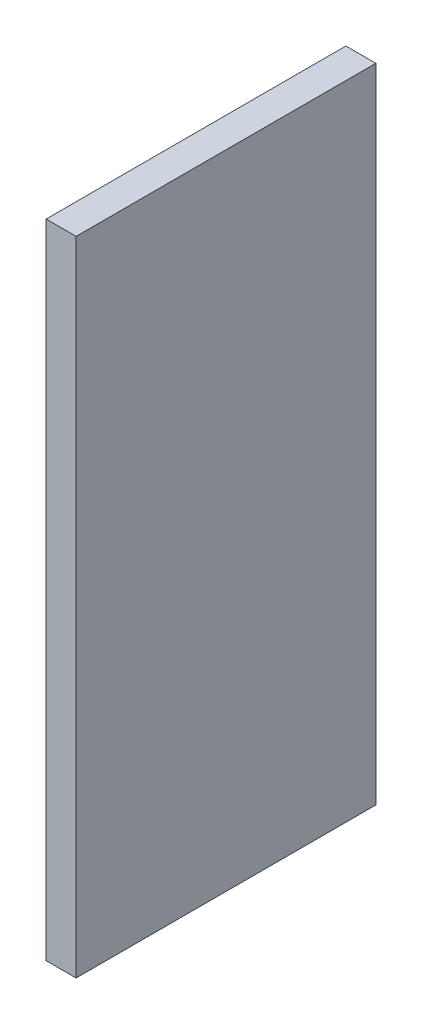
ISO-10303-21;
HEADER;
FILE_DESCRIPTION(('STEP AP214'),'2;1');
FILE_NAME('part.step','',(''),(''),'','','');
FILE_SCHEMA(('AUTOMOTIVE_DESIGN { 1 0 10303 214 1 1 1 1 }'));
ENDSEC;
DATA;
#1=APPLICATION_CONTEXT('core data for automotive mechanical design processes');
#2=APPLICATION_PROTOCOL_DEFINITION('international standard','automotive_design',2000,#1);
#3=PRODUCT_CONTEXT('',#1,'mechanical');
#4=PRODUCT('Part','Part','',(#3));
#5=PRODUCT_RELATED_PRODUCT_CATEGORY('part','',(#4));
#6=PRODUCT_DEFINITION_FORMATION('','',#4);
#7=PRODUCT_DEFINITION_CONTEXT('part definition',#1,'design');
#8=PRODUCT_DEFINITION('design','',#6,#7);
#9=PRODUCT_DEFINITION_SHAPE('','',#8);
#10=(LENGTH_UNIT() NAMED_UNIT(*) SI_UNIT(.MILLI.,.METRE.));
#11=(NAMED_UNIT(*) PLANE_ANGLE_UNIT() SI_UNIT($,.RADIAN.));
#12=(NAMED_UNIT(*) SI_UNIT($,.STERADIAN.) SOLID_ANGLE_UNIT());
#13=UNCERTAINTY_MEASURE_WITH_UNIT(LENGTH_MEASURE(1.E-05),#10,'distance_accuracy_value','');
#14=(GEOMETRIC_REPRESENTATION_CONTEXT(3) GLOBAL_UNCERTAINTY_ASSIGNED_CONTEXT((#13)) GLOBAL_UNIT_ASSIGNED_CONTEXT((#10,
#11,#12)) REPRESENTATION_CONTEXT('',''));
#15=CARTESIAN_POINT('',(0.,0.,0.));
#16=DIRECTION('',(0.,0.,1.));
#17=DIRECTION('',(1.,0.,0.));
#18=AXIS2_PLACEMENT_3D('',#15,#16,#17);
#19=CARTESIAN_POINT('',(0.,150.,70.));
#20=DIRECTION('',(1.,0.,0.));
#21=DIRECTION('',(0.,0.,-1.));
#22=AXIS2_PLACEMENT_3D('',#19,#20,#21);
#23=PLANE('',#22);
#24=DIRECTION('',(0.,-1.,0.));
#25=VECTOR('',#24,1.);
#26=CARTESIAN_POINT('',(0.,150.,0.));
#27=LINE('',#26,#25);
#28=CARTESIAN_POINT('',(0.,150.,0.));
#29=VERTEX_POINT('',#28);
#30=CARTESIAN_POINT('',(0.,0.,0.));
#31=VERTEX_POINT('',#30);
#32=EDGE_CURVE('E95',#29,#31,#27,.T.);
#33=ORIENTED_EDGE('',*,*,#32,.T.);
#34=DIRECTION('',(0.,0.,-1.));
#35=VECTOR('',#34,1.);
#36=CARTESIAN_POINT('',(0.,0.,70.));
#37=LINE('',#36,#35);
#38=CARTESIAN_POINT('',(0.,0.,70.));
#39=VERTEX_POINT('',#38);
#40=EDGE_CURVE('E11',#39,#31,#37,.T.);
#41=ORIENTED_EDGE('',*,*,#40,.F.);
#42=DIRECTION('',(0.,-1.,0.));
#43=VECTOR('',#42,1.);
#44=CARTESIAN_POINT('',(0.,150.,70.));
#45=LINE('',#44,#43);
#46=CARTESIAN_POINT('',(0.,150.,70.));
#47=VERTEX_POINT('',#46);
#48=EDGE_CURVE('E83',#47,#39,#45,.T.);
#49=ORIENTED_EDGE('',*,*,#48,.F.);
#50=DIRECTION('',(0.,0.,-1.));
#51=VECTOR('',#50,1.);
#52=CARTESIAN_POINT('',(0.,150.,70.));
#53=LINE('',#52,#51);
#54=EDGE_CURVE('E91',#47,#29,#53,.T.);
#55=ORIENTED_EDGE('',*,*,#54,.T.);
#56=EDGE_LOOP('',(#33,#41,#49,#55));
#57=FACE_BOUND('',#56,.T.);
#58=ADVANCED_FACE('F32',(#57),#23,.F.);
#59=CARTESIAN_POINT('',(0.,0.,70.));
#60=DIRECTION('',(0.,1.,0.));
#61=DIRECTION('',(0.,0.,1.));
#62=AXIS2_PLACEMENT_3D('',#59,#60,#61);
#63=PLANE('',#62);
#64=DIRECTION('',(1.,0.,0.));
#65=VECTOR('',#64,1.);
#66=CARTESIAN_POINT('',(0.,0.,0.));
#67=LINE('',#66,#65);
#68=CARTESIAN_POINT('',(7.,0.,0.));
#69=VERTEX_POINT('',#68);
#70=EDGE_CURVE('E87',#31,#69,#67,.T.);
#71=ORIENTED_EDGE('',*,*,#70,.T.);
#72=DIRECTION('',(0.,0.,-1.));
#73=VECTOR('',#72,1.);
#74=CARTESIAN_POINT('',(7.,0.,70.));
#75=LINE('',#74,#73);
#76=CARTESIAN_POINT('',(7.,0.,70.));
#77=VERTEX_POINT('',#76);
#78=EDGE_CURVE('E40',#77,#69,#75,.T.);
#79=ORIENTED_EDGE('',*,*,#78,.F.);
#80=DIRECTION('',(1.,0.,0.));
#81=VECTOR('',#80,1.);
#82=CARTESIAN_POINT('',(0.,0.,70.));
#83=LINE('',#82,#81);
#84=EDGE_CURVE('E78',#39,#77,#83,.T.);
#85=ORIENTED_EDGE('',*,*,#84,.F.);
#86=ORIENTED_EDGE('',*,*,#40,.T.);
#87=EDGE_LOOP('',(#71,#79,#85,#86));
#88=FACE_BOUND('',#87,.T.);
#89=ADVANCED_FACE('F86',(#88),#63,.F.);
#90=CARTESIAN_POINT('',(7.,0.,70.));
#91=DIRECTION('',(-1.,0.,0.));
#92=DIRECTION('',(0.,0.,1.));
#93=AXIS2_PLACEMENT_3D('',#90,#91,#92);
#94=PLANE('',#93);
#95=DIRECTION('',(0.,1.,0.));
#96=VECTOR('',#95,1.);
#97=CARTESIAN_POINT('',(7.,0.,0.));
#98=LINE('',#97,#96);
#99=CARTESIAN_POINT('',(7.,150.,0.));
#100=VERTEX_POINT('',#99);
#101=EDGE_CURVE('E65',#69,#100,#98,.T.);
#102=ORIENTED_EDGE('',*,*,#101,.T.);
#103=DIRECTION('',(0.,0.,-1.));
#104=VECTOR('',#103,1.);
#105=CARTESIAN_POINT('',(7.,150.,70.));
#106=LINE('',#105,#104);
#107=CARTESIAN_POINT('',(7.,150.,70.));
#108=VERTEX_POINT('',#107);
#109=EDGE_CURVE('E88',#108,#100,#106,.T.);
#110=ORIENTED_EDGE('',*,*,#109,.F.);
#111=DIRECTION('',(0.,1.,0.));
#112=VECTOR('',#111,1.);
#113=CARTESIAN_POINT('',(7.,0.,70.));
#114=LINE('',#113,#112);
#115=EDGE_CURVE('E81',#77,#108,#114,.T.);
#116=ORIENTED_EDGE('',*,*,#115,.F.);
#117=ORIENTED_EDGE('',*,*,#78,.T.);
#118=EDGE_LOOP('',(#102,#110,#116,#117));
#119=FACE_BOUND('',#118,.T.);
#120=ADVANCED_FACE('F89',(#119),#94,.F.);
#121=CARTESIAN_POINT('',(7.,150.,70.));
#122=DIRECTION('',(0.,-1.,0.));
#123=DIRECTION('',(0.,0.,-1.));
#124=AXIS2_PLACEMENT_3D('',#121,#122,#123);
#125=PLANE('',#124);
#126=DIRECTION('',(-1.,0.,0.));
#127=VECTOR('',#126,1.);
#128=CARTESIAN_POINT('',(7.,150.,0.));
#129=LINE('',#128,#127);
#130=EDGE_CURVE('E71',#100,#29,#129,.T.);
#131=ORIENTED_EDGE('',*,*,#130,.T.);
#132=ORIENTED_EDGE('',*,*,#54,.F.);
#133=DIRECTION('',(-1.,0.,0.));
#134=VECTOR('',#133,1.);
#135=CARTESIAN_POINT('',(7.,150.,70.));
#136=LINE('',#135,#134);
#137=EDGE_CURVE('E48',#108,#47,#136,.T.);
#138=ORIENTED_EDGE('',*,*,#137,.F.);
#139=ORIENTED_EDGE('',*,*,#109,.T.);
#140=EDGE_LOOP('',(#131,#132,#138,#139));
#141=FACE_BOUND('',#140,.T.);
#142=ADVANCED_FACE('F102',(#141),#125,.F.);
#143=CARTESIAN_POINT('',(0.,0.,70.));
#144=DIRECTION('',(0.,0.,1.));
#145=DIRECTION('',(1.,0.,0.));
#146=AXIS2_PLACEMENT_3D('',#143,#144,#145);
#147=PLANE('',#146);
#148=ORIENTED_EDGE('',*,*,#48,.T.);
#149=ORIENTED_EDGE('',*,*,#84,.T.);
#150=ORIENTED_EDGE('',*,*,#115,.T.);
#151=ORIENTED_EDGE('',*,*,#137,.T.);
#152=EDGE_LOOP('',(#148,#149,#150,#151));
#153=FACE_BOUND('',#152,.T.);
#154=ADVANCED_FACE('F79',(#153),#147,.T.);
#155=CARTESIAN_POINT('',(0.,0.,0.));
#156=DIRECTION('',(0.,0.,1.));
#157=DIRECTION('',(1.,0.,0.));
#158=AXIS2_PLACEMENT_3D('',#155,#156,#157);
#159=PLANE('',#158);
#160=ORIENTED_EDGE('',*,*,#32,.F.);
#161=ORIENTED_EDGE('',*,*,#130,.F.);
#162=ORIENTED_EDGE('',*,*,#101,.F.);
#163=ORIENTED_EDGE('',*,*,#70,.F.);
#164=EDGE_LOOP('',(#160,#161,#162,#163));
#165=FACE_BOUND('',#164,.T.);
#166=ADVANCED_FACE('F105',(#165),#159,.F.);
#167=CLOSED_SHELL('',(#58,#89,#120,#142,#154,#166));
#168=MANIFOLD_SOLID_BREP('B2',#167);
#169=ADVANCED_BREP_SHAPE_REPRESENTATION('',(#18,#168),#14);
#170=SHAPE_DEFINITION_REPRESENTATION(#9,#169);
ENDSEC;
END-ISO-10303-21;
